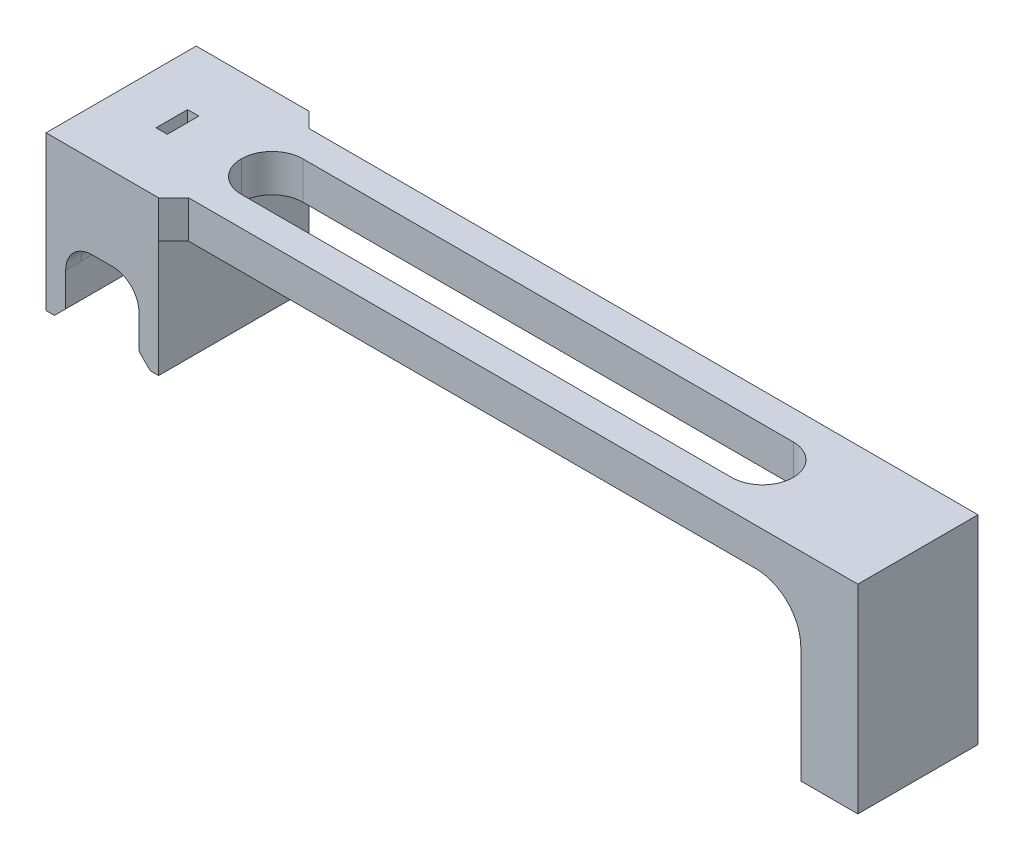
ISO-10303-21;
HEADER;
FILE_DESCRIPTION(('STEP AP214'),'2;1');
FILE_NAME('part.step','',(''),(''),'','','');
FILE_SCHEMA(('AUTOMOTIVE_DESIGN { 1 0 10303 214 1 1 1 1 }'));
ENDSEC;
DATA;
#1=APPLICATION_CONTEXT('core data for automotive mechanical design processes');
#2=APPLICATION_PROTOCOL_DEFINITION('international standard','automotive_design',2000,#1);
#3=PRODUCT_CONTEXT('',#1,'mechanical');
#4=PRODUCT('Part','Part','',(#3));
#5=PRODUCT_RELATED_PRODUCT_CATEGORY('part','',(#4));
#6=PRODUCT_DEFINITION_FORMATION('','',#4);
#7=PRODUCT_DEFINITION_CONTEXT('part definition',#1,'design');
#8=PRODUCT_DEFINITION('design','',#6,#7);
#9=PRODUCT_DEFINITION_SHAPE('','',#8);
#10=(LENGTH_UNIT() NAMED_UNIT(*) SI_UNIT(.MILLI.,.METRE.));
#11=(NAMED_UNIT(*) PLANE_ANGLE_UNIT() SI_UNIT($,.RADIAN.));
#12=(NAMED_UNIT(*) SI_UNIT($,.STERADIAN.) SOLID_ANGLE_UNIT());
#13=UNCERTAINTY_MEASURE_WITH_UNIT(LENGTH_MEASURE(1.E-05),#10,'distance_accuracy_value','');
#14=(GEOMETRIC_REPRESENTATION_CONTEXT(3) GLOBAL_UNCERTAINTY_ASSIGNED_CONTEXT((#13)) GLOBAL_UNIT_ASSIGNED_CONTEXT((#10,
#11,#12)) REPRESENTATION_CONTEXT('',''));
#15=CARTESIAN_POINT('',(0.,0.,0.));
#16=DIRECTION('',(0.,0.,1.));
#17=DIRECTION('',(1.,0.,0.));
#18=AXIS2_PLACEMENT_3D('',#15,#16,#17);
#19=CARTESIAN_POINT('',(0.,0.,0.));
#20=DIRECTION('',(0.,0.,1.));
#21=DIRECTION('',(1.,0.,0.));
#22=AXIS2_PLACEMENT_3D('',#19,#20,#21);
#23=PLANE('',#22);
#24=DIRECTION('',(1.,0.,0.));
#25=VECTOR('',#24,1.);
#26=CARTESIAN_POINT('',(-96.,0.,0.));
#27=LINE('',#26,#25);
#28=CARTESIAN_POINT('',(-81.5,0.,0.));
#29=VERTEX_POINT('',#28);
#30=CARTESIAN_POINT('',(-6.00000000000001,0.,0.));
#31=VERTEX_POINT('',#30);
#32=EDGE_CURVE('E310',#29,#31,#27,.T.);
#33=ORIENTED_EDGE('',*,*,#32,.F.);
#34=DIRECTION('',(0.,1.,0.));
#35=VECTOR('',#34,1.);
#36=CARTESIAN_POINT('',(-81.5,5.,0.));
#37=LINE('',#36,#35);
#38=CARTESIAN_POINT('',(-81.5,5.,0.));
#39=VERTEX_POINT('',#38);
#40=EDGE_CURVE('E465',#29,#39,#37,.T.);
#41=ORIENTED_EDGE('',*,*,#40,.T.);
#42=DIRECTION('',(-1.,0.,0.));
#43=VECTOR('',#42,1.);
#44=CARTESIAN_POINT('',(7.6,5.00000000000001,0.));
#45=LINE('',#44,#43);
#46=CARTESIAN_POINT('',(7.6,5.00000000000001,0.));
#47=VERTEX_POINT('',#46);
#48=EDGE_CURVE('E327',#47,#39,#45,.T.);
#49=ORIENTED_EDGE('',*,*,#48,.F.);
#50=DIRECTION('',(0.,1.,0.));
#51=VECTOR('',#50,1.);
#52=CARTESIAN_POINT('',(7.6,-21.5,0.));
#53=LINE('',#52,#51);
#54=CARTESIAN_POINT('',(7.6,-21.5,0.));
#55=VERTEX_POINT('',#54);
#56=EDGE_CURVE('E342',#55,#47,#53,.T.);
#57=ORIENTED_EDGE('',*,*,#56,.F.);
#58=DIRECTION('',(1.,0.,0.));
#59=VECTOR('',#58,1.);
#60=CARTESIAN_POINT('',(0.,-21.5,0.));
#61=LINE('',#60,#59);
#62=CARTESIAN_POINT('',(0.,-21.5,0.));
#63=VERTEX_POINT('',#62);
#64=EDGE_CURVE('E340',#63,#55,#61,.T.);
#65=ORIENTED_EDGE('',*,*,#64,.F.);
#66=DIRECTION('',(0.,-1.,0.));
#67=VECTOR('',#66,1.);
#68=CARTESIAN_POINT('',(0.,0.,0.));
#69=LINE('',#68,#67);
#70=CARTESIAN_POINT('',(0.,-6.,0.));
#71=VERTEX_POINT('',#70);
#72=EDGE_CURVE('E338',#71,#63,#69,.T.);
#73=ORIENTED_EDGE('',*,*,#72,.F.);
#74=CARTESIAN_POINT('',(-6.,-6.,0.));
#75=DIRECTION('',(0.,0.,1.));
#76=DIRECTION('',(1.,0.,0.));
#77=AXIS2_PLACEMENT_3D('',#74,#75,#76);
#78=CIRCLE('',#77,6.);
#79=EDGE_CURVE('E426',#71,#31,#78,.T.);
#80=ORIENTED_EDGE('',*,*,#79,.T.);
#81=EDGE_LOOP('',(#33,#41,#49,#57,#65,#73,#80));
#82=FACE_BOUND('',#81,.T.);
#83=ADVANCED_FACE('F40',(#82),#23,.F.);
#84=CARTESIAN_POINT('',(0.,0.,16.));
#85=DIRECTION('',(0.,0.,1.));
#86=DIRECTION('',(1.,0.,0.));
#87=AXIS2_PLACEMENT_3D('',#84,#85,#86);
#88=PLANE('',#87);
#89=DIRECTION('',(-1.,0.,0.));
#90=VECTOR('',#89,1.);
#91=CARTESIAN_POINT('',(7.6,5.00000000000001,16.));
#92=LINE('',#91,#90);
#93=CARTESIAN_POINT('',(7.6,5.00000000000001,16.));
#94=VERTEX_POINT('',#93);
#95=CARTESIAN_POINT('',(-81.5,5.,16.));
#96=VERTEX_POINT('',#95);
#97=EDGE_CURVE('E333',#94,#96,#92,.T.);
#98=ORIENTED_EDGE('',*,*,#97,.T.);
#99=DIRECTION('',(0.,-1.,0.));
#100=VECTOR('',#99,1.);
#101=CARTESIAN_POINT('',(-81.5,0.,16.));
#102=LINE('',#101,#100);
#103=CARTESIAN_POINT('',(-81.5,0.,16.));
#104=VERTEX_POINT('',#103);
#105=EDGE_CURVE('E463',#96,#104,#102,.T.);
#106=ORIENTED_EDGE('',*,*,#105,.T.);
#107=DIRECTION('',(1.,0.,0.));
#108=VECTOR('',#107,1.);
#109=CARTESIAN_POINT('',(-96.,0.,16.));
#110=LINE('',#109,#108);
#111=CARTESIAN_POINT('',(-6.00000000000001,0.,16.));
#112=VERTEX_POINT('',#111);
#113=EDGE_CURVE('E324',#104,#112,#110,.T.);
#114=ORIENTED_EDGE('',*,*,#113,.T.);
#115=CARTESIAN_POINT('',(-6.,-6.,16.));
#116=DIRECTION('',(0.,0.,1.));
#117=DIRECTION('',(1.,0.,0.));
#118=AXIS2_PLACEMENT_3D('',#115,#116,#117);
#119=CIRCLE('',#118,6.);
#120=CARTESIAN_POINT('',(0.,-6.,16.));
#121=VERTEX_POINT('',#120);
#122=EDGE_CURVE('E429',#112,#121,#119,.F.);
#123=ORIENTED_EDGE('',*,*,#122,.T.);
#124=DIRECTION('',(0.,-1.,0.));
#125=VECTOR('',#124,1.);
#126=CARTESIAN_POINT('',(0.,0.,16.));
#127=LINE('',#126,#125);
#128=CARTESIAN_POINT('',(0.,-21.5,16.));
#129=VERTEX_POINT('',#128);
#130=EDGE_CURVE('E326',#121,#129,#127,.T.);
#131=ORIENTED_EDGE('',*,*,#130,.T.);
#132=DIRECTION('',(1.,0.,0.));
#133=VECTOR('',#132,1.);
#134=CARTESIAN_POINT('',(0.,-21.5,16.));
#135=LINE('',#134,#133);
#136=CARTESIAN_POINT('',(7.6,-21.5,16.));
#137=VERTEX_POINT('',#136);
#138=EDGE_CURVE('E329',#129,#137,#135,.T.);
#139=ORIENTED_EDGE('',*,*,#138,.T.);
#140=DIRECTION('',(0.,1.,0.));
#141=VECTOR('',#140,1.);
#142=CARTESIAN_POINT('',(7.6,-21.5,16.));
#143=LINE('',#142,#141);
#144=EDGE_CURVE('E331',#137,#94,#143,.T.);
#145=ORIENTED_EDGE('',*,*,#144,.T.);
#146=EDGE_LOOP('',(#98,#106,#114,#123,#131,#139,#145));
#147=FACE_BOUND('',#146,.T.);
#148=ADVANCED_FACE('F553',(#147),#88,.T.);
#149=CARTESIAN_POINT('',(-96.,0.,16.));
#150=DIRECTION('',(0.,1.,0.));
#151=DIRECTION('',(0.,0.,1.));
#152=AXIS2_PLACEMENT_3D('',#149,#150,#151);
#153=PLANE('',#152);
#154=CARTESIAN_POINT('',(-78.4,0.,7.99999999999999));
#155=DIRECTION('',(0.,1.,0.));
#156=DIRECTION('',(0.,0.,1.));
#157=AXIS2_PLACEMENT_3D('',#154,#155,#156);
#158=CIRCLE('',#157,4.1);
#159=CARTESIAN_POINT('',(-78.4,0.,3.9));
#160=VERTEX_POINT('',#159);
#161=CARTESIAN_POINT('',(-82.5,0.,7.99999999999999));
#162=VERTEX_POINT('',#161);
#163=EDGE_CURVE('E382',#160,#162,#158,.T.);
#164=ORIENTED_EDGE('',*,*,#163,.T.);
#165=CARTESIAN_POINT('',(-78.4,0.,8.));
#166=DIRECTION('',(0.,1.,0.));
#167=DIRECTION('',(0.,0.,1.));
#168=AXIS2_PLACEMENT_3D('',#165,#166,#167);
#169=CIRCLE('',#168,4.1);
#170=CARTESIAN_POINT('',(-78.4,0.,12.1));
#171=VERTEX_POINT('',#170);
#172=EDGE_CURVE('E386',#162,#171,#169,.T.);
#173=ORIENTED_EDGE('',*,*,#172,.T.);
#174=DIRECTION('',(-1.,0.,0.));
#175=VECTOR('',#174,1.);
#176=CARTESIAN_POINT('',(-9.,0.,12.1));
#177=LINE('',#176,#175);
#178=CARTESIAN_POINT('',(-13.1,0.,12.1));
#179=VERTEX_POINT('',#178);
#180=EDGE_CURVE('E317',#179,#171,#177,.T.);
#181=ORIENTED_EDGE('',*,*,#180,.F.);
#182=CARTESIAN_POINT('',(-13.1,0.,8.));
#183=DIRECTION('',(0.,1.,0.));
#184=DIRECTION('',(0.,0.,1.));
#185=AXIS2_PLACEMENT_3D('',#182,#183,#184);
#186=CIRCLE('',#185,4.1);
#187=CARTESIAN_POINT('',(-9.,0.,8.));
#188=VERTEX_POINT('',#187);
#189=EDGE_CURVE('E394',#179,#188,#186,.T.);
#190=ORIENTED_EDGE('',*,*,#189,.T.);
#191=CARTESIAN_POINT('',(-13.1,0.,8.));
#192=DIRECTION('',(0.,1.,0.));
#193=DIRECTION('',(0.,0.,1.));
#194=AXIS2_PLACEMENT_3D('',#191,#192,#193);
#195=CIRCLE('',#194,4.1);
#196=CARTESIAN_POINT('',(-13.1,0.,3.9));
#197=VERTEX_POINT('',#196);
#198=EDGE_CURVE('E390',#188,#197,#195,.T.);
#199=ORIENTED_EDGE('',*,*,#198,.T.);
#200=DIRECTION('',(1.,0.,0.));
#201=VECTOR('',#200,1.);
#202=CARTESIAN_POINT('',(-9.,0.,3.90000000000001));
#203=LINE('',#202,#201);
#204=EDGE_CURVE('E318',#160,#197,#203,.T.);
#205=ORIENTED_EDGE('',*,*,#204,.F.);
#206=EDGE_LOOP('',(#164,#173,#181,#190,#199,#205));
#207=FACE_BOUND('',#206,.T.);
#208=DIRECTION('',(0.,0.,1.));
#209=VECTOR('',#208,1.);
#210=CARTESIAN_POINT('',(-83.5,0.,16.));
#211=LINE('',#210,#209);
#212=CARTESIAN_POINT('',(-83.5,0.,-2.));
#213=VERTEX_POINT('',#212);
#214=CARTESIAN_POINT('',(-83.5,0.,18.));
#215=VERTEX_POINT('',#214);
#216=EDGE_CURVE('E284',#213,#215,#211,.T.);
#217=ORIENTED_EDGE('',*,*,#216,.F.);
#218=DIRECTION('',(-0.707106781186548,0.,-0.707106781186547));
#219=VECTOR('',#218,1.);
#220=CARTESIAN_POINT('',(-80.75,0.,0.749999999999992));
#221=LINE('',#220,#219);
#222=EDGE_CURVE('E471',#213,#29,#221,.F.);
#223=ORIENTED_EDGE('',*,*,#222,.T.);
#224=ORIENTED_EDGE('',*,*,#32,.T.);
#225=DIRECTION('',(0.,0.,-1.));
#226=VECTOR('',#225,1.);
#227=CARTESIAN_POINT('',(-6.,0.,16.));
#228=LINE('',#227,#226);
#229=EDGE_CURVE('E423',#31,#112,#228,.F.);
#230=ORIENTED_EDGE('',*,*,#229,.T.);
#231=ORIENTED_EDGE('',*,*,#113,.F.);
#232=DIRECTION('',(-0.707106781186548,0.,0.707106781186547));
#233=VECTOR('',#232,1.);
#234=CARTESIAN_POINT('',(-88.75,0.,23.25));
#235=LINE('',#234,#233);
#236=EDGE_CURVE('E469',#104,#215,#235,.T.);
#237=ORIENTED_EDGE('',*,*,#236,.T.);
#238=EDGE_LOOP('',(#217,#223,#224,#230,#231,#237));
#239=FACE_BOUND('',#238,.T.);
#240=ADVANCED_FACE('F559',(#207,#239),#153,.F.);
#241=CARTESIAN_POINT('',(0.,0.,16.));
#242=DIRECTION('',(1.,0.,0.));
#243=DIRECTION('',(0.,1.,0.));
#244=AXIS2_PLACEMENT_3D('',#241,#242,#243);
#245=PLANE('',#244);
#246=ORIENTED_EDGE('',*,*,#130,.F.);
#247=DIRECTION('',(0.,0.,-1.));
#248=VECTOR('',#247,1.);
#249=CARTESIAN_POINT('',(0.,-6.,0.));
#250=LINE('',#249,#248);
#251=EDGE_CURVE('E420',#121,#71,#250,.T.);
#252=ORIENTED_EDGE('',*,*,#251,.T.);
#253=ORIENTED_EDGE('',*,*,#72,.T.);
#254=DIRECTION('',(0.,0.,-1.));
#255=VECTOR('',#254,1.);
#256=CARTESIAN_POINT('',(0.,-21.5,16.));
#257=LINE('',#256,#255);
#258=EDGE_CURVE('E351',#129,#63,#257,.T.);
#259=ORIENTED_EDGE('',*,*,#258,.F.);
#260=EDGE_LOOP('',(#246,#252,#253,#259));
#261=FACE_BOUND('',#260,.T.);
#262=ADVANCED_FACE('F577',(#261),#245,.F.);
#263=CARTESIAN_POINT('',(0.,-21.5,16.));
#264=DIRECTION('',(0.,1.,0.));
#265=DIRECTION('',(0.,0.,1.));
#266=AXIS2_PLACEMENT_3D('',#263,#264,#265);
#267=PLANE('',#266);
#268=ORIENTED_EDGE('',*,*,#64,.T.);
#269=DIRECTION('',(0.,0.,-1.));
#270=VECTOR('',#269,1.);
#271=CARTESIAN_POINT('',(7.6,-21.5,16.));
#272=LINE('',#271,#270);
#273=EDGE_CURVE('E348',#137,#55,#272,.T.);
#274=ORIENTED_EDGE('',*,*,#273,.F.);
#275=ORIENTED_EDGE('',*,*,#138,.F.);
#276=ORIENTED_EDGE('',*,*,#258,.T.);
#277=EDGE_LOOP('',(#268,#274,#275,#276));
#278=FACE_BOUND('',#277,.T.);
#279=ADVANCED_FACE('F573',(#278),#267,.F.);
#280=CARTESIAN_POINT('',(7.6,-21.5,16.));
#281=DIRECTION('',(-1.,0.,0.));
#282=DIRECTION('',(0.,0.,1.));
#283=AXIS2_PLACEMENT_3D('',#280,#281,#282);
#284=PLANE('',#283);
#285=ORIENTED_EDGE('',*,*,#56,.T.);
#286=DIRECTION('',(0.,0.,-1.));
#287=VECTOR('',#286,1.);
#288=CARTESIAN_POINT('',(7.6,5.00000000000001,16.));
#289=LINE('',#288,#287);
#290=EDGE_CURVE('E336',#94,#47,#289,.T.);
#291=ORIENTED_EDGE('',*,*,#290,.F.);
#292=ORIENTED_EDGE('',*,*,#144,.F.);
#293=ORIENTED_EDGE('',*,*,#273,.T.);
#294=EDGE_LOOP('',(#285,#291,#292,#293));
#295=FACE_BOUND('',#294,.T.);
#296=ADVANCED_FACE('F569',(#295),#284,.F.);
#297=CARTESIAN_POINT('',(7.6,5.00000000000001,16.));
#298=DIRECTION('',(0.,-1.,0.));
#299=DIRECTION('',(1.,0.,0.));
#300=AXIS2_PLACEMENT_3D('',#297,#298,#299);
#301=PLANE('',#300);
#302=DIRECTION('',(1.,0.,0.));
#303=VECTOR('',#302,1.);
#304=CARTESIAN_POINT('',(7.6,5.00000000000001,5.9));
#305=LINE('',#304,#303);
#306=CARTESIAN_POINT('',(-91.75,5.,5.9));
#307=VERTEX_POINT('',#306);
#308=CARTESIAN_POINT('',(-90.25,5.,5.9));
#309=VERTEX_POINT('',#308);
#310=EDGE_CURVE('E366',#307,#309,#305,.T.);
#311=ORIENTED_EDGE('',*,*,#310,.T.);
#312=DIRECTION('',(0.,0.,1.));
#313=VECTOR('',#312,1.);
#314=CARTESIAN_POINT('',(-90.25,5.,16.));
#315=LINE('',#314,#313);
#316=CARTESIAN_POINT('',(-90.25,5.,10.1));
#317=VERTEX_POINT('',#316);
#318=EDGE_CURVE('E369',#309,#317,#315,.T.);
#319=ORIENTED_EDGE('',*,*,#318,.T.);
#320=DIRECTION('',(-1.,0.,0.));
#321=VECTOR('',#320,1.);
#322=CARTESIAN_POINT('',(7.6,5.00000000000001,10.1));
#323=LINE('',#322,#321);
#324=CARTESIAN_POINT('',(-91.75,5.,10.1));
#325=VERTEX_POINT('',#324);
#326=EDGE_CURVE('E360',#317,#325,#323,.T.);
#327=ORIENTED_EDGE('',*,*,#326,.T.);
#328=DIRECTION('',(0.,0.,-1.));
#329=VECTOR('',#328,1.);
#330=CARTESIAN_POINT('',(-91.75,5.,16.));
#331=LINE('',#330,#329);
#332=EDGE_CURVE('E363',#325,#307,#331,.T.);
#333=ORIENTED_EDGE('',*,*,#332,.T.);
#334=EDGE_LOOP('',(#311,#319,#327,#333));
#335=FACE_BOUND('',#334,.T.);
#336=DIRECTION('',(0.,0.,1.));
#337=VECTOR('',#336,1.);
#338=CARTESIAN_POINT('',(-98.5,5.,0.));
#339=LINE('',#338,#337);
#340=CARTESIAN_POINT('',(-98.5,5.,-2.));
#341=VERTEX_POINT('',#340);
#342=CARTESIAN_POINT('',(-98.5,5.,18.));
#343=VERTEX_POINT('',#342);
#344=EDGE_CURVE('E288',#341,#343,#339,.T.);
#345=ORIENTED_EDGE('',*,*,#344,.T.);
#346=DIRECTION('',(-1.,0.,0.));
#347=VECTOR('',#346,1.);
#348=CARTESIAN_POINT('',(-83.5,5.,18.));
#349=LINE('',#348,#347);
#350=CARTESIAN_POINT('',(-83.5,5.,18.));
#351=VERTEX_POINT('',#350);
#352=EDGE_CURVE('E506',#351,#343,#349,.T.);
#353=ORIENTED_EDGE('',*,*,#352,.F.);
#354=DIRECTION('',(0.707106781186548,0.,-0.707106781186547));
#355=VECTOR('',#354,1.);
#356=CARTESIAN_POINT('',(-36.95,5.00000000000001,-28.55));
#357=LINE('',#356,#355);
#358=EDGE_CURVE('E467',#351,#96,#357,.T.);
#359=ORIENTED_EDGE('',*,*,#358,.T.);
#360=ORIENTED_EDGE('',*,*,#97,.F.);
#361=ORIENTED_EDGE('',*,*,#290,.T.);
#362=ORIENTED_EDGE('',*,*,#48,.T.);
#363=DIRECTION('',(0.707106781186548,0.,0.707106781186547));
#364=VECTOR('',#363,1.);
#365=CARTESIAN_POINT('',(-28.95,5.00000000000001,52.55));
#366=LINE('',#365,#364);
#367=CARTESIAN_POINT('',(-83.5,5.,-2.));
#368=VERTEX_POINT('',#367);
#369=EDGE_CURVE('E473',#39,#368,#366,.F.);
#370=ORIENTED_EDGE('',*,*,#369,.T.);
#371=DIRECTION('',(1.,0.,0.));
#372=VECTOR('',#371,1.);
#373=CARTESIAN_POINT('',(-83.5,5.,-2.));
#374=LINE('',#373,#372);
#375=EDGE_CURVE('E489',#341,#368,#374,.T.);
#376=ORIENTED_EDGE('',*,*,#375,.F.);
#377=EDGE_LOOP('',(#345,#353,#359,#360,#361,#362,#370,#376));
#378=FACE_BOUND('',#377,.T.);
#379=CARTESIAN_POINT('',(-13.1,5.00000000000001,8.));
#380=DIRECTION('',(0.,-1.,0.));
#381=DIRECTION('',(1.,0.,0.));
#382=AXIS2_PLACEMENT_3D('',#379,#380,#381);
#383=CIRCLE('',#382,4.1);
#384=CARTESIAN_POINT('',(-13.1,5.00000000000001,3.9));
#385=VERTEX_POINT('',#384);
#386=CARTESIAN_POINT('',(-9.,5.00000000000001,8.));
#387=VERTEX_POINT('',#386);
#388=EDGE_CURVE('E392',#385,#387,#383,.T.);
#389=ORIENTED_EDGE('',*,*,#388,.T.);
#390=CARTESIAN_POINT('',(-13.1,5.00000000000001,8.));
#391=DIRECTION('',(0.,-1.,0.));
#392=DIRECTION('',(1.,0.,0.));
#393=AXIS2_PLACEMENT_3D('',#390,#391,#392);
#394=CIRCLE('',#393,4.1);
#395=CARTESIAN_POINT('',(-13.1,5.00000000000001,12.1));
#396=VERTEX_POINT('',#395);
#397=EDGE_CURVE('E396',#387,#396,#394,.T.);
#398=ORIENTED_EDGE('',*,*,#397,.T.);
#399=DIRECTION('',(-1.,0.,0.));
#400=VECTOR('',#399,1.);
#401=CARTESIAN_POINT('',(7.6,5.00000000000001,12.1));
#402=LINE('',#401,#400);
#403=CARTESIAN_POINT('',(-78.4,5.,12.1));
#404=VERTEX_POINT('',#403);
#405=EDGE_CURVE('E357',#396,#404,#402,.T.);
#406=ORIENTED_EDGE('',*,*,#405,.T.);
#407=CARTESIAN_POINT('',(-78.4,5.,8.));
#408=DIRECTION('',(0.,-1.,0.));
#409=DIRECTION('',(1.,0.,0.));
#410=AXIS2_PLACEMENT_3D('',#407,#408,#409);
#411=CIRCLE('',#410,4.1);
#412=CARTESIAN_POINT('',(-82.5,5.,7.99999999999999));
#413=VERTEX_POINT('',#412);
#414=EDGE_CURVE('E388',#404,#413,#411,.T.);
#415=ORIENTED_EDGE('',*,*,#414,.T.);
#416=CARTESIAN_POINT('',(-78.4,5.,7.99999999999999));
#417=DIRECTION('',(0.,-1.,0.));
#418=DIRECTION('',(1.,0.,0.));
#419=AXIS2_PLACEMENT_3D('',#416,#417,#418);
#420=CIRCLE('',#419,4.1);
#421=CARTESIAN_POINT('',(-78.4,5.,3.9));
#422=VERTEX_POINT('',#421);
#423=EDGE_CURVE('E384',#413,#422,#420,.T.);
#424=ORIENTED_EDGE('',*,*,#423,.T.);
#425=DIRECTION('',(1.,0.,0.));
#426=VECTOR('',#425,1.);
#427=CARTESIAN_POINT('',(7.6,5.00000000000001,3.90000000000001));
#428=LINE('',#427,#426);
#429=EDGE_CURVE('E354',#422,#385,#428,.T.);
#430=ORIENTED_EDGE('',*,*,#429,.T.);
#431=EDGE_LOOP('',(#389,#398,#406,#415,#424,#430));
#432=FACE_BOUND('',#431,.T.);
#433=ADVANCED_FACE('F565',(#335,#378,#432),#301,.F.);
#434=CARTESIAN_POINT('',(-9.,10.,12.1));
#435=DIRECTION('',(0.,0.,1.));
#436=DIRECTION('',(1.,0.,0.));
#437=AXIS2_PLACEMENT_3D('',#434,#435,#436);
#438=PLANE('',#437);
#439=ORIENTED_EDGE('',*,*,#180,.T.);
#440=DIRECTION('',(0.,-1.,0.));
#441=VECTOR('',#440,1.);
#442=CARTESIAN_POINT('',(-78.4,5.00000000000001,12.1));
#443=LINE('',#442,#441);
#444=EDGE_CURVE('E380',#171,#404,#443,.F.);
#445=ORIENTED_EDGE('',*,*,#444,.T.);
#446=ORIENTED_EDGE('',*,*,#405,.F.);
#447=DIRECTION('',(0.,-1.,0.));
#448=VECTOR('',#447,1.);
#449=CARTESIAN_POINT('',(-13.1,0.,12.1));
#450=LINE('',#449,#448);
#451=EDGE_CURVE('E378',#396,#179,#450,.T.);
#452=ORIENTED_EDGE('',*,*,#451,.T.);
#453=EDGE_LOOP('',(#439,#445,#446,#452));
#454=FACE_BOUND('',#453,.T.);
#455=ADVANCED_FACE('F568',(#454),#438,.F.);
#456=CARTESIAN_POINT('',(-9.,10.,3.90000000000001));
#457=DIRECTION('',(0.,0.,-1.));
#458=DIRECTION('',(-1.,0.,0.));
#459=AXIS2_PLACEMENT_3D('',#456,#457,#458);
#460=PLANE('',#459);
#461=ORIENTED_EDGE('',*,*,#429,.F.);
#462=DIRECTION('',(0.,-1.,0.));
#463=VECTOR('',#462,1.);
#464=CARTESIAN_POINT('',(-78.4,0.,3.9));
#465=LINE('',#464,#463);
#466=EDGE_CURVE('E375',#422,#160,#465,.T.);
#467=ORIENTED_EDGE('',*,*,#466,.T.);
#468=ORIENTED_EDGE('',*,*,#204,.T.);
#469=DIRECTION('',(0.,-1.,0.));
#470=VECTOR('',#469,1.);
#471=CARTESIAN_POINT('',(-13.1,5.00000000000001,3.9));
#472=LINE('',#471,#470);
#473=EDGE_CURVE('E372',#197,#385,#472,.F.);
#474=ORIENTED_EDGE('',*,*,#473,.T.);
#475=EDGE_LOOP('',(#461,#467,#468,#474));
#476=FACE_BOUND('',#475,.T.);
#477=ADVANCED_FACE('F685',(#476),#460,.F.);
#478=CARTESIAN_POINT('',(-90.25,10.,5.9));
#479=DIRECTION('',(1.,0.,0.));
#480=DIRECTION('',(0.,0.,-1.));
#481=AXIS2_PLACEMENT_3D('',#478,#479,#480);
#482=PLANE('',#481);
#483=DIRECTION('',(0.,-1.,0.));
#484=VECTOR('',#483,1.);
#485=CARTESIAN_POINT('',(-90.25,10.,5.9));
#486=LINE('',#485,#484);
#487=CARTESIAN_POINT('',(-90.25,-6.,5.9));
#488=VERTEX_POINT('',#487);
#489=EDGE_CURVE('E308',#309,#488,#486,.T.);
#490=ORIENTED_EDGE('',*,*,#489,.T.);
#491=DIRECTION('',(0.,0.,1.));
#492=VECTOR('',#491,1.);
#493=CARTESIAN_POINT('',(-90.25,-6.,0.));
#494=LINE('',#493,#492);
#495=CARTESIAN_POINT('',(-90.25,-6.,10.1));
#496=VERTEX_POINT('',#495);
#497=EDGE_CURVE('E301',#488,#496,#494,.T.);
#498=ORIENTED_EDGE('',*,*,#497,.T.);
#499=DIRECTION('',(0.,-1.,0.));
#500=VECTOR('',#499,1.);
#501=CARTESIAN_POINT('',(-90.25,10.,10.1));
#502=LINE('',#501,#500);
#503=EDGE_CURVE('E315',#317,#496,#502,.T.);
#504=ORIENTED_EDGE('',*,*,#503,.F.);
#505=ORIENTED_EDGE('',*,*,#318,.F.);
#506=EDGE_LOOP('',(#490,#498,#504,#505));
#507=FACE_BOUND('',#506,.T.);
#508=ADVANCED_FACE('F698',(#507),#482,.F.);
#509=CARTESIAN_POINT('',(-91.75,10.,5.9));
#510=DIRECTION('',(0.,0.,-1.));
#511=DIRECTION('',(-1.,0.,0.));
#512=AXIS2_PLACEMENT_3D('',#509,#510,#511);
#513=PLANE('',#512);
#514=DIRECTION('',(0.,-1.,0.));
#515=VECTOR('',#514,1.);
#516=CARTESIAN_POINT('',(-91.75,10.,5.9));
#517=LINE('',#516,#515);
#518=CARTESIAN_POINT('',(-91.75,-6.,5.9));
#519=VERTEX_POINT('',#518);
#520=EDGE_CURVE('E311',#307,#519,#517,.T.);
#521=ORIENTED_EDGE('',*,*,#520,.T.);
#522=DIRECTION('',(1.,0.,0.));
#523=VECTOR('',#522,1.);
#524=CARTESIAN_POINT('',(0.,-5.99999999999999,5.9));
#525=LINE('',#524,#523);
#526=EDGE_CURVE('E298',#519,#488,#525,.T.);
#527=ORIENTED_EDGE('',*,*,#526,.T.);
#528=ORIENTED_EDGE('',*,*,#489,.F.);
#529=ORIENTED_EDGE('',*,*,#310,.F.);
#530=EDGE_LOOP('',(#521,#527,#528,#529));
#531=FACE_BOUND('',#530,.T.);
#532=ADVANCED_FACE('F702',(#531),#513,.F.);
#533=CARTESIAN_POINT('',(-91.75,10.,5.9));
#534=DIRECTION('',(-1.,0.,0.));
#535=DIRECTION('',(0.,0.,1.));
#536=AXIS2_PLACEMENT_3D('',#533,#534,#535);
#537=PLANE('',#536);
#538=DIRECTION('',(0.,-1.,0.));
#539=VECTOR('',#538,1.);
#540=CARTESIAN_POINT('',(-91.75,10.,10.1));
#541=LINE('',#540,#539);
#542=CARTESIAN_POINT('',(-91.75,-6.,10.1));
#543=VERTEX_POINT('',#542);
#544=EDGE_CURVE('E313',#325,#543,#541,.T.);
#545=ORIENTED_EDGE('',*,*,#544,.T.);
#546=DIRECTION('',(0.,0.,-1.));
#547=VECTOR('',#546,1.);
#548=CARTESIAN_POINT('',(-91.75,-6.,0.));
#549=LINE('',#548,#547);
#550=EDGE_CURVE('E295',#543,#519,#549,.T.);
#551=ORIENTED_EDGE('',*,*,#550,.T.);
#552=ORIENTED_EDGE('',*,*,#520,.F.);
#553=ORIENTED_EDGE('',*,*,#332,.F.);
#554=EDGE_LOOP('',(#545,#551,#552,#553));
#555=FACE_BOUND('',#554,.T.);
#556=ADVANCED_FACE('F706',(#555),#537,.F.);
#557=CARTESIAN_POINT('',(-91.75,10.,10.1));
#558=DIRECTION('',(0.,0.,1.));
#559=DIRECTION('',(1.,0.,0.));
#560=AXIS2_PLACEMENT_3D('',#557,#558,#559);
#561=PLANE('',#560);
#562=ORIENTED_EDGE('',*,*,#503,.T.);
#563=DIRECTION('',(-1.,0.,0.));
#564=VECTOR('',#563,1.);
#565=CARTESIAN_POINT('',(0.,-5.99999999999999,10.1));
#566=LINE('',#565,#564);
#567=EDGE_CURVE('E304',#496,#543,#566,.T.);
#568=ORIENTED_EDGE('',*,*,#567,.T.);
#569=ORIENTED_EDGE('',*,*,#544,.F.);
#570=ORIENTED_EDGE('',*,*,#326,.F.);
#571=EDGE_LOOP('',(#562,#568,#569,#570));
#572=FACE_BOUND('',#571,.T.);
#573=ADVANCED_FACE('F593',(#572),#561,.F.);
#574=CARTESIAN_POINT('',(-78.4,10.,8.));
#575=DIRECTION('',(0.,1.,0.));
#576=DIRECTION('',(0.,0.,1.));
#577=AXIS2_PLACEMENT_3D('',#574,#575,#576);
#578=CYLINDRICAL_SURFACE('',#577,4.1);
#579=DIRECTION('',(0.,-1.,0.));
#580=VECTOR('',#579,1.);
#581=CARTESIAN_POINT('',(-82.5,0.,8.));
#582=LINE('',#581,#580);
#583=EDGE_CURVE('E321',#413,#162,#582,.T.);
#584=ORIENTED_EDGE('',*,*,#583,.F.);
#585=ORIENTED_EDGE('',*,*,#414,.F.);
#586=ORIENTED_EDGE('',*,*,#444,.F.);
#587=ORIENTED_EDGE('',*,*,#172,.F.);
#588=EDGE_LOOP('',(#584,#585,#586,#587));
#589=FACE_BOUND('',#588,.T.);
#590=ADVANCED_FACE('F589',(#589),#578,.F.);
#591=CARTESIAN_POINT('',(-78.4,10.,7.99999999999999));
#592=DIRECTION('',(0.,1.,0.));
#593=DIRECTION('',(0.,0.,1.));
#594=AXIS2_PLACEMENT_3D('',#591,#592,#593);
#595=CYLINDRICAL_SURFACE('',#594,4.1);
#596=ORIENTED_EDGE('',*,*,#423,.F.);
#597=ORIENTED_EDGE('',*,*,#583,.T.);
#598=ORIENTED_EDGE('',*,*,#163,.F.);
#599=ORIENTED_EDGE('',*,*,#466,.F.);
#600=EDGE_LOOP('',(#596,#597,#598,#599));
#601=FACE_BOUND('',#600,.T.);
#602=ADVANCED_FACE('F585',(#601),#595,.F.);
#603=CARTESIAN_POINT('',(-13.1,10.,8.));
#604=DIRECTION('',(0.,1.,0.));
#605=DIRECTION('',(0.,0.,1.));
#606=AXIS2_PLACEMENT_3D('',#603,#604,#605);
#607=CYLINDRICAL_SURFACE('',#606,4.1);
#608=ORIENTED_EDGE('',*,*,#451,.F.);
#609=ORIENTED_EDGE('',*,*,#397,.F.);
#610=DIRECTION('',(0.,-1.,0.));
#611=VECTOR('',#610,1.);
#612=CARTESIAN_POINT('',(-9.,5.00000000000001,8.));
#613=LINE('',#612,#611);
#614=EDGE_CURVE('E307',#188,#387,#613,.F.);
#615=ORIENTED_EDGE('',*,*,#614,.F.);
#616=ORIENTED_EDGE('',*,*,#189,.F.);
#617=EDGE_LOOP('',(#608,#609,#615,#616));
#618=FACE_BOUND('',#617,.T.);
#619=ADVANCED_FACE('F588',(#618),#607,.F.);
#620=CARTESIAN_POINT('',(-13.1,10.,8.));
#621=DIRECTION('',(0.,1.,0.));
#622=DIRECTION('',(0.,0.,1.));
#623=AXIS2_PLACEMENT_3D('',#620,#621,#622);
#624=CYLINDRICAL_SURFACE('',#623,4.1);
#625=ORIENTED_EDGE('',*,*,#388,.F.);
#626=ORIENTED_EDGE('',*,*,#473,.F.);
#627=ORIENTED_EDGE('',*,*,#198,.F.);
#628=ORIENTED_EDGE('',*,*,#614,.T.);
#629=EDGE_LOOP('',(#625,#626,#627,#628));
#630=FACE_BOUND('',#629,.T.);
#631=ADVANCED_FACE('F595',(#630),#624,.F.);
#632=CARTESIAN_POINT('',(0.,-5.99999999999999,0.));
#633=DIRECTION('',(0.,1.,0.));
#634=DIRECTION('',(-1.,0.,0.));
#635=AXIS2_PLACEMENT_3D('',#632,#633,#634);
#636=PLANE('',#635);
#637=DIRECTION('',(0.,0.,-1.));
#638=VECTOR('',#637,1.);
#639=CARTESIAN_POINT('',(-92.375,-6.,0.));
#640=LINE('',#639,#638);
#641=CARTESIAN_POINT('',(-92.375,-6.,16.));
#642=VERTEX_POINT('',#641);
#643=CARTESIAN_POINT('',(-92.375,-6.,0.));
#644=VERTEX_POINT('',#643);
#645=EDGE_CURVE('E398',#642,#644,#640,.T.);
#646=ORIENTED_EDGE('',*,*,#645,.T.);
#647=DIRECTION('',(0.,0.,1.));
#648=VECTOR('',#647,1.);
#649=CARTESIAN_POINT('',(-92.375,-6.,0.));
#650=LINE('',#649,#648);
#651=CARTESIAN_POINT('',(-92.375,-6.,-2.));
#652=VERTEX_POINT('',#651);
#653=EDGE_CURVE('E445',#644,#652,#650,.F.);
#654=ORIENTED_EDGE('',*,*,#653,.T.);
#655=DIRECTION('',(-1.,0.,0.));
#656=VECTOR('',#655,1.);
#657=CARTESIAN_POINT('',(-95.875,-6.,-2.));
#658=LINE('',#657,#656);
#659=CARTESIAN_POINT('',(-89.625,-6.,-2.));
#660=VERTEX_POINT('',#659);
#661=EDGE_CURVE('E499',#660,#652,#658,.T.);
#662=ORIENTED_EDGE('',*,*,#661,.F.);
#663=DIRECTION('',(0.,0.,1.));
#664=VECTOR('',#663,1.);
#665=CARTESIAN_POINT('',(-89.625,-6.,0.));
#666=LINE('',#665,#664);
#667=CARTESIAN_POINT('',(-89.625,-6.,0.));
#668=VERTEX_POINT('',#667);
#669=EDGE_CURVE('E442',#660,#668,#666,.T.);
#670=ORIENTED_EDGE('',*,*,#669,.T.);
#671=DIRECTION('',(0.,0.,1.));
#672=VECTOR('',#671,1.);
#673=CARTESIAN_POINT('',(-89.625,-6.,0.));
#674=LINE('',#673,#672);
#675=CARTESIAN_POINT('',(-89.625,-6.,16.));
#676=VERTEX_POINT('',#675);
#677=EDGE_CURVE('E405',#668,#676,#674,.T.);
#678=ORIENTED_EDGE('',*,*,#677,.T.);
#679=DIRECTION('',(0.,0.,-1.));
#680=VECTOR('',#679,1.);
#681=CARTESIAN_POINT('',(-89.625,-6.,0.));
#682=LINE('',#681,#680);
#683=CARTESIAN_POINT('',(-89.625,-6.,18.));
#684=VERTEX_POINT('',#683);
#685=EDGE_CURVE('E440',#676,#684,#682,.F.);
#686=ORIENTED_EDGE('',*,*,#685,.T.);
#687=DIRECTION('',(1.,0.,0.));
#688=VECTOR('',#687,1.);
#689=CARTESIAN_POINT('',(-86.125,-6.,18.));
#690=LINE('',#689,#688);
#691=CARTESIAN_POINT('',(-92.375,-6.,18.));
#692=VERTEX_POINT('',#691);
#693=EDGE_CURVE('E513',#692,#684,#690,.T.);
#694=ORIENTED_EDGE('',*,*,#693,.F.);
#695=DIRECTION('',(0.,0.,-1.));
#696=VECTOR('',#695,1.);
#697=CARTESIAN_POINT('',(-92.375,-6.,0.));
#698=LINE('',#697,#696);
#699=EDGE_CURVE('E437',#692,#642,#698,.T.);
#700=ORIENTED_EDGE('',*,*,#699,.T.);
#701=EDGE_LOOP('',(#646,#654,#662,#670,#678,#686,#694,#700));
#702=FACE_BOUND('',#701,.T.);
#703=ORIENTED_EDGE('',*,*,#550,.F.);
#704=ORIENTED_EDGE('',*,*,#567,.F.);
#705=ORIENTED_EDGE('',*,*,#497,.F.);
#706=ORIENTED_EDGE('',*,*,#526,.F.);
#707=EDGE_LOOP('',(#703,#704,#705,#706));
#708=FACE_BOUND('',#707,.T.);
#709=ADVANCED_FACE('F528',(#702,#708),#636,.F.);
#710=CARTESIAN_POINT('',(-95.875,5.,0.));
#711=DIRECTION('',(1.,0.,0.));
#712=DIRECTION('',(0.,1.,0.));
#713=AXIS2_PLACEMENT_3D('',#710,#711,#712);
#714=PLANE('',#713);
#715=DIRECTION('',(0.,1.,0.));
#716=VECTOR('',#715,1.);
#717=CARTESIAN_POINT('',(-95.875,-19.,18.));
#718=LINE('',#717,#716);
#719=CARTESIAN_POINT('',(-95.875,-14.,18.));
#720=VERTEX_POINT('',#719);
#721=CARTESIAN_POINT('',(-95.875,-9.5,18.));
#722=VERTEX_POINT('',#721);
#723=EDGE_CURVE('E512',#720,#722,#718,.T.);
#724=ORIENTED_EDGE('',*,*,#723,.F.);
#725=DIRECTION('',(0.,0.,-1.));
#726=VECTOR('',#725,1.);
#727=CARTESIAN_POINT('',(-95.875,-14.,-2.));
#728=LINE('',#727,#726);
#729=CARTESIAN_POINT('',(-95.875,-14.,-2.));
#730=VERTEX_POINT('',#729);
#731=EDGE_CURVE('E481',#720,#730,#728,.T.);
#732=ORIENTED_EDGE('',*,*,#731,.T.);
#733=DIRECTION('',(0.,-1.,0.));
#734=VECTOR('',#733,1.);
#735=CARTESIAN_POINT('',(-95.875,-19.,-2.));
#736=LINE('',#735,#734);
#737=CARTESIAN_POINT('',(-95.875,-9.5,-2.));
#738=VERTEX_POINT('',#737);
#739=EDGE_CURVE('E502',#738,#730,#736,.T.);
#740=ORIENTED_EDGE('',*,*,#739,.F.);
#741=DIRECTION('',(0.,0.,1.));
#742=VECTOR('',#741,1.);
#743=CARTESIAN_POINT('',(-95.875,-9.5,0.));
#744=LINE('',#743,#742);
#745=CARTESIAN_POINT('',(-95.875,-9.5,0.));
#746=VERTEX_POINT('',#745);
#747=EDGE_CURVE('E434',#738,#746,#744,.T.);
#748=ORIENTED_EDGE('',*,*,#747,.T.);
#749=DIRECTION('',(0.,0.,-1.));
#750=VECTOR('',#749,1.);
#751=CARTESIAN_POINT('',(-95.875,-9.5,0.));
#752=LINE('',#751,#750);
#753=CARTESIAN_POINT('',(-95.875,-9.5,16.));
#754=VERTEX_POINT('',#753);
#755=EDGE_CURVE('E410',#746,#754,#752,.F.);
#756=ORIENTED_EDGE('',*,*,#755,.T.);
#757=DIRECTION('',(0.,0.,-1.));
#758=VECTOR('',#757,1.);
#759=CARTESIAN_POINT('',(-95.875,-9.5,0.));
#760=LINE('',#759,#758);
#761=EDGE_CURVE('E431',#754,#722,#760,.F.);
#762=ORIENTED_EDGE('',*,*,#761,.T.);
#763=EDGE_LOOP('',(#724,#732,#740,#748,#756,#762));
#764=FACE_BOUND('',#763,.T.);
#765=ADVANCED_FACE('F624',(#764),#714,.T.);
#766=CARTESIAN_POINT('',(-98.5,5.,0.));
#767=DIRECTION('',(1.,0.,0.));
#768=DIRECTION('',(0.,1.,0.));
#769=AXIS2_PLACEMENT_3D('',#766,#767,#768);
#770=PLANE('',#769);
#771=DIRECTION('',(0.,1.,0.));
#772=VECTOR('',#771,1.);
#773=CARTESIAN_POINT('',(-98.5,5.,-2.));
#774=LINE('',#773,#772);
#775=CARTESIAN_POINT('',(-98.5,-15.5,-2.));
#776=VERTEX_POINT('',#775);
#777=EDGE_CURVE('E504',#776,#341,#774,.T.);
#778=ORIENTED_EDGE('',*,*,#777,.F.);
#779=DIRECTION('',(0.,0.,-1.));
#780=VECTOR('',#779,1.);
#781=CARTESIAN_POINT('',(-98.5,-15.5,-2.));
#782=LINE('',#781,#780);
#783=CARTESIAN_POINT('',(-98.5,-15.5,18.));
#784=VERTEX_POINT('',#783);
#785=EDGE_CURVE('E270',#784,#776,#782,.T.);
#786=ORIENTED_EDGE('',*,*,#785,.F.);
#787=DIRECTION('',(0.,-1.,0.));
#788=VECTOR('',#787,1.);
#789=CARTESIAN_POINT('',(-98.5,5.,18.));
#790=LINE('',#789,#788);
#791=EDGE_CURVE('E509',#343,#784,#790,.T.);
#792=ORIENTED_EDGE('',*,*,#791,.F.);
#793=ORIENTED_EDGE('',*,*,#344,.F.);
#794=EDGE_LOOP('',(#778,#786,#792,#793));
#795=FACE_BOUND('',#794,.T.);
#796=ADVANCED_FACE('F638',(#795),#770,.F.);
#797=CARTESIAN_POINT('',(-83.5,-19.,0.));
#798=DIRECTION('',(-1.,0.,0.));
#799=DIRECTION('',(0.,-1.,0.));
#800=AXIS2_PLACEMENT_3D('',#797,#798,#799);
#801=PLANE('',#800);
#802=ORIENTED_EDGE('',*,*,#216,.T.);
#803=DIRECTION('',(0.,1.,0.));
#804=VECTOR('',#803,1.);
#805=CARTESIAN_POINT('',(-83.5,-19.,18.));
#806=LINE('',#805,#804);
#807=CARTESIAN_POINT('',(-83.5,-15.5,18.));
#808=VERTEX_POINT('',#807);
#809=EDGE_CURVE('E277',#808,#215,#806,.T.);
#810=ORIENTED_EDGE('',*,*,#809,.F.);
#811=DIRECTION('',(0.,0.,-1.));
#812=VECTOR('',#811,1.);
#813=CARTESIAN_POINT('',(-83.5,-15.5,-2.));
#814=LINE('',#813,#812);
#815=CARTESIAN_POINT('',(-83.5,-15.5,-2.));
#816=VERTEX_POINT('',#815);
#817=EDGE_CURVE('E261',#808,#816,#814,.T.);
#818=ORIENTED_EDGE('',*,*,#817,.T.);
#819=DIRECTION('',(0.,-1.,0.));
#820=VECTOR('',#819,1.);
#821=CARTESIAN_POINT('',(-83.5,5.,-2.));
#822=LINE('',#821,#820);
#823=EDGE_CURVE('E488',#213,#816,#822,.T.);
#824=ORIENTED_EDGE('',*,*,#823,.F.);
#825=EDGE_LOOP('',(#802,#810,#818,#824));
#826=FACE_BOUND('',#825,.T.);
#827=ADVANCED_FACE('F283',(#826),#801,.F.);
#828=CARTESIAN_POINT('',(-86.125,-19.,0.));
#829=DIRECTION('',(-1.,0.,0.));
#830=DIRECTION('',(0.,-1.,0.));
#831=AXIS2_PLACEMENT_3D('',#828,#829,#830);
#832=PLANE('',#831);
#833=DIRECTION('',(0.,1.,0.));
#834=VECTOR('',#833,1.);
#835=CARTESIAN_POINT('',(-86.125,-19.,-2.));
#836=LINE('',#835,#834);
#837=CARTESIAN_POINT('',(-86.125,-14.,-2.));
#838=VERTEX_POINT('',#837);
#839=CARTESIAN_POINT('',(-86.125,-9.5,-2.));
#840=VERTEX_POINT('',#839);
#841=EDGE_CURVE('E497',#838,#840,#836,.T.);
#842=ORIENTED_EDGE('',*,*,#841,.F.);
#843=DIRECTION('',(0.,0.,1.));
#844=VECTOR('',#843,1.);
#845=CARTESIAN_POINT('',(-86.125,-14.,18.));
#846=LINE('',#845,#844);
#847=CARTESIAN_POINT('',(-86.125,-14.,18.));
#848=VERTEX_POINT('',#847);
#849=EDGE_CURVE('E11',#838,#848,#846,.T.);
#850=ORIENTED_EDGE('',*,*,#849,.T.);
#851=DIRECTION('',(0.,-1.,0.));
#852=VECTOR('',#851,1.);
#853=CARTESIAN_POINT('',(-86.125,-19.,18.));
#854=LINE('',#853,#852);
#855=CARTESIAN_POINT('',(-86.125,-9.5,18.));
#856=VERTEX_POINT('',#855);
#857=EDGE_CURVE('E290',#856,#848,#854,.T.);
#858=ORIENTED_EDGE('',*,*,#857,.F.);
#859=DIRECTION('',(0.,0.,-1.));
#860=VECTOR('',#859,1.);
#861=CARTESIAN_POINT('',(-86.125,-9.5,0.));
#862=LINE('',#861,#860);
#863=CARTESIAN_POINT('',(-86.125,-9.5,16.));
#864=VERTEX_POINT('',#863);
#865=EDGE_CURVE('E447',#856,#864,#862,.T.);
#866=ORIENTED_EDGE('',*,*,#865,.T.);
#867=DIRECTION('',(0.,0.,1.));
#868=VECTOR('',#867,1.);
#869=CARTESIAN_POINT('',(-86.125,-9.5,0.));
#870=LINE('',#869,#868);
#871=CARTESIAN_POINT('',(-86.125,-9.5,0.));
#872=VERTEX_POINT('',#871);
#873=EDGE_CURVE('E408',#864,#872,#870,.F.);
#874=ORIENTED_EDGE('',*,*,#873,.T.);
#875=DIRECTION('',(0.,0.,1.));
#876=VECTOR('',#875,1.);
#877=CARTESIAN_POINT('',(-86.125,-9.5,0.));
#878=LINE('',#877,#876);
#879=EDGE_CURVE('E450',#872,#840,#878,.F.);
#880=ORIENTED_EDGE('',*,*,#879,.T.);
#881=EDGE_LOOP('',(#842,#850,#858,#866,#874,#880));
#882=FACE_BOUND('',#881,.T.);
#883=ADVANCED_FACE('F520',(#882),#832,.T.);
#884=CARTESIAN_POINT('',(-89.625,-9.5,0.));
#885=DIRECTION('',(0.,0.,1.));
#886=DIRECTION('',(0.,-1.,0.));
#887=AXIS2_PLACEMENT_3D('',#884,#885,#886);
#888=CYLINDRICAL_SURFACE('',#887,3.5);
#889=CARTESIAN_POINT('',(-89.625,-9.5,0.));
#890=DIRECTION('',(0.,0.,1.));
#891=DIRECTION('',(1.,0.,0.));
#892=AXIS2_PLACEMENT_3D('',#889,#890,#891);
#893=CIRCLE('',#892,3.5);
#894=EDGE_CURVE('E414',#872,#668,#893,.T.);
#895=ORIENTED_EDGE('',*,*,#894,.F.);
#896=ORIENTED_EDGE('',*,*,#873,.F.);
#897=CARTESIAN_POINT('',(-89.625,-9.5,16.));
#898=DIRECTION('',(0.,0.,1.));
#899=DIRECTION('',(1.,0.,0.));
#900=AXIS2_PLACEMENT_3D('',#897,#898,#899);
#901=CIRCLE('',#900,3.5);
#902=EDGE_CURVE('E412',#676,#864,#901,.F.);
#903=ORIENTED_EDGE('',*,*,#902,.F.);
#904=ORIENTED_EDGE('',*,*,#677,.F.);
#905=EDGE_LOOP('',(#895,#896,#903,#904));
#906=FACE_BOUND('',#905,.T.);
#907=ADVANCED_FACE('F536',(#906),#888,.F.);
#908=CARTESIAN_POINT('',(-92.375,-9.5,0.));
#909=DIRECTION('',(0.,0.,-1.));
#910=DIRECTION('',(0.,1.,0.));
#911=AXIS2_PLACEMENT_3D('',#908,#909,#910);
#912=CYLINDRICAL_SURFACE('',#911,3.5);
#913=CARTESIAN_POINT('',(-92.375,-9.5,16.));
#914=DIRECTION('',(0.,0.,1.));
#915=DIRECTION('',(1.,0.,0.));
#916=AXIS2_PLACEMENT_3D('',#913,#914,#915);
#917=CIRCLE('',#916,3.5);
#918=EDGE_CURVE('E418',#754,#642,#917,.F.);
#919=ORIENTED_EDGE('',*,*,#918,.F.);
#920=ORIENTED_EDGE('',*,*,#755,.F.);
#921=CARTESIAN_POINT('',(-92.375,-9.5,0.));
#922=DIRECTION('',(0.,0.,1.));
#923=DIRECTION('',(1.,0.,0.));
#924=AXIS2_PLACEMENT_3D('',#921,#922,#923);
#925=CIRCLE('',#924,3.5);
#926=EDGE_CURVE('E416',#644,#746,#925,.T.);
#927=ORIENTED_EDGE('',*,*,#926,.F.);
#928=ORIENTED_EDGE('',*,*,#645,.F.);
#929=EDGE_LOOP('',(#919,#920,#927,#928));
#930=FACE_BOUND('',#929,.T.);
#931=ADVANCED_FACE('F604',(#930),#912,.F.);
#932=CARTESIAN_POINT('',(-6.,-6.,16.));
#933=DIRECTION('',(0.,0.,1.));
#934=DIRECTION('',(1.,0.,0.));
#935=AXIS2_PLACEMENT_3D('',#932,#933,#934);
#936=CYLINDRICAL_SURFACE('',#935,6.);
#937=ORIENTED_EDGE('',*,*,#122,.F.);
#938=ORIENTED_EDGE('',*,*,#229,.F.);
#939=ORIENTED_EDGE('',*,*,#79,.F.);
#940=ORIENTED_EDGE('',*,*,#251,.F.);
#941=EDGE_LOOP('',(#937,#938,#939,#940));
#942=FACE_BOUND('',#941,.T.);
#943=ADVANCED_FACE('F607',(#942),#936,.F.);
#944=CARTESIAN_POINT('',(0.,0.,18.));
#945=DIRECTION('',(0.,0.,1.));
#946=DIRECTION('',(1.,0.,0.));
#947=AXIS2_PLACEMENT_3D('',#944,#945,#946);
#948=PLANE('',#947);
#949=DIRECTION('',(-1.,0.,0.));
#950=VECTOR('',#949,1.);
#951=CARTESIAN_POINT('',(-83.5,-15.5,18.));
#952=LINE('',#951,#950);
#953=CARTESIAN_POINT('',(-97.375,-15.5,18.));
#954=VERTEX_POINT('',#953);
#955=EDGE_CURVE('E269',#954,#784,#952,.T.);
#956=ORIENTED_EDGE('',*,*,#955,.F.);
#957=DIRECTION('',(0.70710678118655,0.707106781186545,0.));
#958=VECTOR('',#957,1.);
#959=CARTESIAN_POINT('',(-40.9374999999996,40.9374999999999,18.));
#960=LINE('',#959,#958);
#961=EDGE_CURVE('E479',#954,#720,#960,.T.);
#962=ORIENTED_EDGE('',*,*,#961,.T.);
#963=ORIENTED_EDGE('',*,*,#723,.T.);
#964=CARTESIAN_POINT('',(-92.375,-9.5,18.));
#965=DIRECTION('',(0.,0.,1.));
#966=DIRECTION('',(1.,0.,0.));
#967=AXIS2_PLACEMENT_3D('',#964,#965,#966);
#968=CIRCLE('',#967,3.5);
#969=EDGE_CURVE('E459',#722,#692,#968,.F.);
#970=ORIENTED_EDGE('',*,*,#969,.T.);
#971=ORIENTED_EDGE('',*,*,#693,.T.);
#972=CARTESIAN_POINT('',(-89.625,-9.5,18.));
#973=DIRECTION('',(0.,0.,1.));
#974=DIRECTION('',(1.,0.,0.));
#975=AXIS2_PLACEMENT_3D('',#972,#973,#974);
#976=CIRCLE('',#975,3.5);
#977=EDGE_CURVE('E457',#684,#856,#976,.F.);
#978=ORIENTED_EDGE('',*,*,#977,.T.);
#979=ORIENTED_EDGE('',*,*,#857,.T.);
#980=DIRECTION('',(0.707106781186548,-0.707106781186548,0.));
#981=VECTOR('',#980,1.);
#982=CARTESIAN_POINT('',(-50.0625,-50.0625,18.));
#983=LINE('',#982,#981);
#984=CARTESIAN_POINT('',(-84.625,-15.5,18.));
#985=VERTEX_POINT('',#984);
#986=EDGE_CURVE('E281',#848,#985,#983,.T.);
#987=ORIENTED_EDGE('',*,*,#986,.T.);
#988=EDGE_CURVE('E264',#808,#985,#952,.T.);
#989=ORIENTED_EDGE('',*,*,#988,.F.);
#990=ORIENTED_EDGE('',*,*,#809,.T.);
#991=EDGE_CURVE('E286',#215,#351,#806,.T.);
#992=ORIENTED_EDGE('',*,*,#991,.T.);
#993=ORIENTED_EDGE('',*,*,#352,.T.);
#994=ORIENTED_EDGE('',*,*,#791,.T.);
#995=EDGE_LOOP('',(#956,#962,#963,#970,#971,#978,#979,#987,#989,#990,#992,#993,#994));
#996=FACE_BOUND('',#995,.T.);
#997=ADVANCED_FACE('F275',(#996),#948,.T.);
#998=CARTESIAN_POINT('',(0.,0.,-2.));
#999=DIRECTION('',(0.,0.,1.));
#1000=DIRECTION('',(1.,0.,0.));
#1001=AXIS2_PLACEMENT_3D('',#998,#999,#1000);
#1002=PLANE('',#1001);
#1003=ORIENTED_EDGE('',*,*,#739,.T.);
#1004=DIRECTION('',(-0.70710678118655,-0.707106781186545,0.));
#1005=VECTOR('',#1004,1.);
#1006=CARTESIAN_POINT('',(-97.375,-15.5,-2.));
#1007=LINE('',#1006,#1005);
#1008=CARTESIAN_POINT('',(-97.375,-15.5,-2.));
#1009=VERTEX_POINT('',#1008);
#1010=EDGE_CURVE('E484',#730,#1009,#1007,.T.);
#1011=ORIENTED_EDGE('',*,*,#1010,.T.);
#1012=DIRECTION('',(-1.,0.,0.));
#1013=VECTOR('',#1012,1.);
#1014=CARTESIAN_POINT('',(0.,-15.5,-2.));
#1015=LINE('',#1014,#1013);
#1016=EDGE_CURVE('E461',#1009,#776,#1015,.T.);
#1017=ORIENTED_EDGE('',*,*,#1016,.T.);
#1018=ORIENTED_EDGE('',*,*,#777,.T.);
#1019=ORIENTED_EDGE('',*,*,#375,.T.);
#1020=EDGE_CURVE('E495',#368,#213,#822,.T.);
#1021=ORIENTED_EDGE('',*,*,#1020,.T.);
#1022=ORIENTED_EDGE('',*,*,#823,.T.);
#1023=DIRECTION('',(-1.,0.,0.));
#1024=VECTOR('',#1023,1.);
#1025=CARTESIAN_POINT('',(-83.5,-15.5,-2.));
#1026=LINE('',#1025,#1024);
#1027=CARTESIAN_POINT('',(-84.625,-15.5,-2.));
#1028=VERTEX_POINT('',#1027);
#1029=EDGE_CURVE('E265',#816,#1028,#1026,.T.);
#1030=ORIENTED_EDGE('',*,*,#1029,.T.);
#1031=DIRECTION('',(-0.707106781186548,0.707106781186548,0.));
#1032=VECTOR('',#1031,1.);
#1033=CARTESIAN_POINT('',(-84.625,-15.5,-2.));
#1034=LINE('',#1033,#1032);
#1035=EDGE_CURVE('E55',#1028,#838,#1034,.T.);
#1036=ORIENTED_EDGE('',*,*,#1035,.T.);
#1037=ORIENTED_EDGE('',*,*,#841,.T.);
#1038=CARTESIAN_POINT('',(-89.625,-9.5,-2.));
#1039=DIRECTION('',(0.,0.,1.));
#1040=DIRECTION('',(1.,0.,0.));
#1041=AXIS2_PLACEMENT_3D('',#1038,#1039,#1040);
#1042=CIRCLE('',#1041,3.5);
#1043=EDGE_CURVE('E455',#840,#660,#1042,.T.);
#1044=ORIENTED_EDGE('',*,*,#1043,.T.);
#1045=ORIENTED_EDGE('',*,*,#661,.T.);
#1046=CARTESIAN_POINT('',(-92.375,-9.5,-2.));
#1047=DIRECTION('',(0.,0.,1.));
#1048=DIRECTION('',(1.,0.,0.));
#1049=AXIS2_PLACEMENT_3D('',#1046,#1047,#1048);
#1050=CIRCLE('',#1049,3.5);
#1051=EDGE_CURVE('E453',#652,#738,#1050,.T.);
#1052=ORIENTED_EDGE('',*,*,#1051,.T.);
#1053=EDGE_LOOP('',(#1003,#1011,#1017,#1018,#1019,#1021,#1022,#1030,#1036,#1037,#1044,#1045,#1052));
#1054=FACE_BOUND('',#1053,.T.);
#1055=ADVANCED_FACE('F486',(#1054),#1002,.F.);
#1056=CARTESIAN_POINT('',(-92.375,-9.5,0.));
#1057=DIRECTION('',(0.,0.,1.));
#1058=DIRECTION('',(0.,-1.,0.));
#1059=AXIS2_PLACEMENT_3D('',#1056,#1057,#1058);
#1060=CYLINDRICAL_SURFACE('',#1059,3.5);
#1061=ORIENTED_EDGE('',*,*,#1051,.F.);
#1062=ORIENTED_EDGE('',*,*,#653,.F.);
#1063=ORIENTED_EDGE('',*,*,#926,.T.);
#1064=ORIENTED_EDGE('',*,*,#747,.F.);
#1065=EDGE_LOOP('',(#1061,#1062,#1063,#1064));
#1066=FACE_BOUND('',#1065,.T.);
#1067=ADVANCED_FACE('F550',(#1066),#1060,.F.);
#1068=CARTESIAN_POINT('',(-89.625,-9.5,0.));
#1069=DIRECTION('',(0.,0.,1.));
#1070=DIRECTION('',(0.,-1.,0.));
#1071=AXIS2_PLACEMENT_3D('',#1068,#1069,#1070);
#1072=CYLINDRICAL_SURFACE('',#1071,3.5);
#1073=ORIENTED_EDGE('',*,*,#1043,.F.);
#1074=ORIENTED_EDGE('',*,*,#879,.F.);
#1075=ORIENTED_EDGE('',*,*,#894,.T.);
#1076=ORIENTED_EDGE('',*,*,#669,.F.);
#1077=EDGE_LOOP('',(#1073,#1074,#1075,#1076));
#1078=FACE_BOUND('',#1077,.T.);
#1079=ADVANCED_FACE('F532',(#1078),#1072,.F.);
#1080=CARTESIAN_POINT('',(-89.625,-9.5,0.));
#1081=DIRECTION('',(0.,0.,-1.));
#1082=DIRECTION('',(0.,1.,0.));
#1083=AXIS2_PLACEMENT_3D('',#1080,#1081,#1082);
#1084=CYLINDRICAL_SURFACE('',#1083,3.5);
#1085=ORIENTED_EDGE('',*,*,#977,.F.);
#1086=ORIENTED_EDGE('',*,*,#685,.F.);
#1087=ORIENTED_EDGE('',*,*,#902,.T.);
#1088=ORIENTED_EDGE('',*,*,#865,.F.);
#1089=EDGE_LOOP('',(#1085,#1086,#1087,#1088));
#1090=FACE_BOUND('',#1089,.T.);
#1091=ADVANCED_FACE('F539',(#1090),#1084,.F.);
#1092=CARTESIAN_POINT('',(-92.375,-9.5,0.));
#1093=DIRECTION('',(0.,0.,-1.));
#1094=DIRECTION('',(0.,1.,0.));
#1095=AXIS2_PLACEMENT_3D('',#1092,#1093,#1094);
#1096=CYLINDRICAL_SURFACE('',#1095,3.5);
#1097=ORIENTED_EDGE('',*,*,#969,.F.);
#1098=ORIENTED_EDGE('',*,*,#761,.F.);
#1099=ORIENTED_EDGE('',*,*,#918,.T.);
#1100=ORIENTED_EDGE('',*,*,#699,.F.);
#1101=EDGE_LOOP('',(#1097,#1098,#1099,#1100));
#1102=FACE_BOUND('',#1101,.T.);
#1103=ADVANCED_FACE('F541',(#1102),#1096,.F.);
#1104=CARTESIAN_POINT('',(-83.5,-15.5,-2.));
#1105=DIRECTION('',(0.,1.,0.));
#1106=DIRECTION('',(-1.,0.,0.));
#1107=AXIS2_PLACEMENT_3D('',#1104,#1105,#1106);
#1108=PLANE('',#1107);
#1109=ORIENTED_EDGE('',*,*,#1016,.F.);
#1110=DIRECTION('',(0.,0.,1.));
#1111=VECTOR('',#1110,1.);
#1112=CARTESIAN_POINT('',(-97.375,-15.5,18.));
#1113=LINE('',#1112,#1111);
#1114=EDGE_CURVE('E475',#1009,#954,#1113,.T.);
#1115=ORIENTED_EDGE('',*,*,#1114,.T.);
#1116=ORIENTED_EDGE('',*,*,#955,.T.);
#1117=ORIENTED_EDGE('',*,*,#785,.T.);
#1118=EDGE_LOOP('',(#1109,#1115,#1116,#1117));
#1119=FACE_BOUND('',#1118,.T.);
#1120=ADVANCED_FACE('F547',(#1119),#1108,.F.);
#1121=ORIENTED_EDGE('',*,*,#988,.T.);
#1122=DIRECTION('',(0.,0.,-1.));
#1123=VECTOR('',#1122,1.);
#1124=CARTESIAN_POINT('',(-84.625,-15.5,-2.));
#1125=LINE('',#1124,#1123);
#1126=EDGE_CURVE('E48',#985,#1028,#1125,.T.);
#1127=ORIENTED_EDGE('',*,*,#1126,.T.);
#1128=ORIENTED_EDGE('',*,*,#1029,.F.);
#1129=ORIENTED_EDGE('',*,*,#817,.F.);
#1130=EDGE_LOOP('',(#1121,#1127,#1128,#1129));
#1131=FACE_BOUND('',#1130,.T.);
#1132=ADVANCED_FACE('F263',(#1131),#1108,.F.);
#1133=CARTESIAN_POINT('',(-83.5,-19.,18.));
#1134=DIRECTION('',(-0.707106781186547,0.,-0.707106781186548));
#1135=DIRECTION('',(0.,1.,0.));
#1136=AXIS2_PLACEMENT_3D('',#1133,#1134,#1135);
#1137=PLANE('',#1136);
#1138=ORIENTED_EDGE('',*,*,#236,.F.);
#1139=ORIENTED_EDGE('',*,*,#105,.F.);
#1140=ORIENTED_EDGE('',*,*,#358,.F.);
#1141=ORIENTED_EDGE('',*,*,#991,.F.);
#1142=EDGE_LOOP('',(#1138,#1139,#1140,#1141));
#1143=FACE_BOUND('',#1142,.T.);
#1144=ADVANCED_FACE('F658',(#1143),#1137,.F.);
#1145=CARTESIAN_POINT('',(-83.5,-19.,-1.99999999999997));
#1146=DIRECTION('',(0.707106781186547,0.,-0.707106781186548));
#1147=DIRECTION('',(0.,1.,0.));
#1148=AXIS2_PLACEMENT_3D('',#1145,#1146,#1147);
#1149=PLANE('',#1148);
#1150=ORIENTED_EDGE('',*,*,#369,.F.);
#1151=ORIENTED_EDGE('',*,*,#40,.F.);
#1152=ORIENTED_EDGE('',*,*,#222,.F.);
#1153=ORIENTED_EDGE('',*,*,#1020,.F.);
#1154=EDGE_LOOP('',(#1150,#1151,#1152,#1153));
#1155=FACE_BOUND('',#1154,.T.);
#1156=ADVANCED_FACE('F645',(#1155),#1149,.T.);
#1157=CARTESIAN_POINT('',(-97.375,-15.5,-2.));
#1158=DIRECTION('',(0.707106781186545,-0.70710678118655,0.));
#1159=DIRECTION('',(0.,0.,-1.));
#1160=AXIS2_PLACEMENT_3D('',#1157,#1158,#1159);
#1161=PLANE('',#1160);
#1162=ORIENTED_EDGE('',*,*,#1010,.F.);
#1163=ORIENTED_EDGE('',*,*,#731,.F.);
#1164=ORIENTED_EDGE('',*,*,#961,.F.);
#1165=ORIENTED_EDGE('',*,*,#1114,.F.);
#1166=EDGE_LOOP('',(#1162,#1163,#1164,#1165));
#1167=FACE_BOUND('',#1166,.T.);
#1168=ADVANCED_FACE('F628',(#1167),#1161,.T.);
#1169=CARTESIAN_POINT('',(-84.625,-15.5,-2.));
#1170=DIRECTION('',(-0.707106781186547,-0.707106781186547,0.));
#1171=DIRECTION('',(0.,0.,1.));
#1172=AXIS2_PLACEMENT_3D('',#1169,#1170,#1171);
#1173=PLANE('',#1172);
#1174=ORIENTED_EDGE('',*,*,#986,.F.);
#1175=ORIENTED_EDGE('',*,*,#849,.F.);
#1176=ORIENTED_EDGE('',*,*,#1035,.F.);
#1177=ORIENTED_EDGE('',*,*,#1126,.F.);
#1178=EDGE_LOOP('',(#1174,#1175,#1176,#1177));
#1179=FACE_BOUND('',#1178,.T.);
#1180=ADVANCED_FACE('F42',(#1179),#1173,.T.);
#1181=CLOSED_SHELL('',(#83,#148,#240,#262,#279,#296,#433,#455,#477,#508,#532,#556,#573,#590,
#602,#619,#631,#709,#765,#796,#827,#883,#907,#931,#943,#997,#1055,#1067,#1079,#1091,#1103,#1120,
#1132,#1144,#1156,#1168,#1180));
#1182=MANIFOLD_SOLID_BREP('B2',#1181);
#1183=ADVANCED_BREP_SHAPE_REPRESENTATION('',(#18,#1182),#14);
#1184=SHAPE_DEFINITION_REPRESENTATION(#9,#1183);
ENDSEC;
END-ISO-10303-21;
